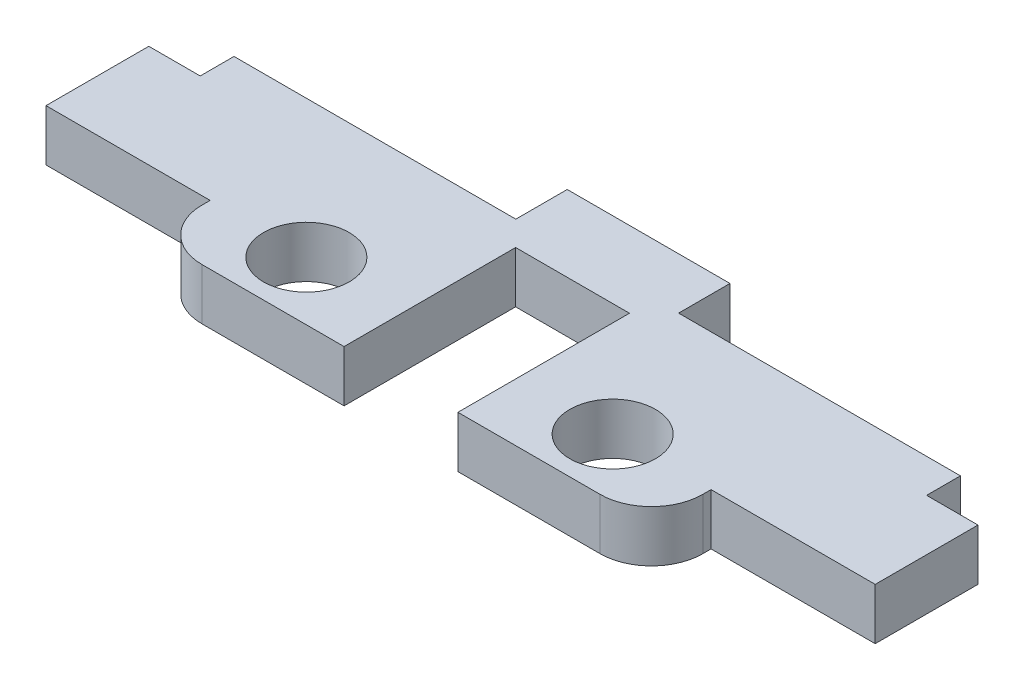
ISO-10303-21;
HEADER;
FILE_DESCRIPTION(('STEP AP214'),'2;1');
FILE_NAME('part.step','',(''),(''),'','','');
FILE_SCHEMA(('AUTOMOTIVE_DESIGN { 1 0 10303 214 1 1 1 1 }'));
ENDSEC;
DATA;
#1=APPLICATION_CONTEXT('core data for automotive mechanical design processes');
#2=APPLICATION_PROTOCOL_DEFINITION('international standard','automotive_design',2000,#1);
#3=PRODUCT_CONTEXT('',#1,'mechanical');
#4=PRODUCT('Part','Part','',(#3));
#5=PRODUCT_RELATED_PRODUCT_CATEGORY('part','',(#4));
#6=PRODUCT_DEFINITION_FORMATION('','',#4);
#7=PRODUCT_DEFINITION_CONTEXT('part definition',#1,'design');
#8=PRODUCT_DEFINITION('design','',#6,#7);
#9=PRODUCT_DEFINITION_SHAPE('','',#8);
#10=(LENGTH_UNIT() NAMED_UNIT(*) SI_UNIT(.MILLI.,.METRE.));
#11=(NAMED_UNIT(*) PLANE_ANGLE_UNIT() SI_UNIT($,.RADIAN.));
#12=(NAMED_UNIT(*) SI_UNIT($,.STERADIAN.) SOLID_ANGLE_UNIT());
#13=UNCERTAINTY_MEASURE_WITH_UNIT(LENGTH_MEASURE(1.E-05),#10,'distance_accuracy_value','');
#14=(GEOMETRIC_REPRESENTATION_CONTEXT(3) GLOBAL_UNCERTAINTY_ASSIGNED_CONTEXT((#13)) GLOBAL_UNIT_ASSIGNED_CONTEXT((#10,
#11,#12)) REPRESENTATION_CONTEXT('',''));
#15=CARTESIAN_POINT('',(0.,0.,0.));
#16=DIRECTION('',(0.,0.,1.));
#17=DIRECTION('',(1.,0.,0.));
#18=AXIS2_PLACEMENT_3D('',#15,#16,#17);
#19=CARTESIAN_POINT('',(70.0878100238819,6.,-6.40569379770578));
#20=DIRECTION('',(0.,-1.,0.));
#21=DIRECTION('',(0.,0.,-1.));
#22=AXIS2_PLACEMENT_3D('',#19,#20,#21);
#23=PLANE('',#22);
#24=CARTESIAN_POINT('',(28.9745197224591,6.,-7.23783964696655));
#25=DIRECTION('',(0.,1.,0.));
#26=DIRECTION('',(0.,0.,1.));
#27=AXIS2_PLACEMENT_3D('',#24,#25,#26);
#28=CIRCLE('',#27,5.00000000000204);
#29=CARTESIAN_POINT('',(28.9745197224591,6.,-2.23783964696451));
#30=VERTEX_POINT('',#29);
#31=EDGE_CURVE('E219',#30,#30,#28,.T.);
#32=ORIENTED_EDGE('',*,*,#31,.F.);
#33=EDGE_LOOP('',(#32));
#34=FACE_BOUND('',#33,.T.);
#35=CARTESIAN_POINT('',(70.0878100238819,6.,-6.40569379770578));
#36=DIRECTION('',(0.,1.,0.));
#37=DIRECTION('',(0.,0.,-1.));
#38=AXIS2_PLACEMENT_3D('',#35,#36,#37);
#39=CIRCLE('',#38,6.);
#40=CARTESIAN_POINT('',(70.0878100238819,6.,-0.405693797705776));
#41=VERTEX_POINT('',#40);
#42=CARTESIAN_POINT('',(76.0878100238819,6.,-6.40569379770582));
#43=VERTEX_POINT('',#42);
#44=EDGE_CURVE('E258',#41,#43,#39,.T.);
#45=ORIENTED_EDGE('',*,*,#44,.T.);
#46=DIRECTION('',(0.,0.,-1.));
#47=VECTOR('',#46,1.);
#48=CARTESIAN_POINT('',(76.0878100238819,6.,-7.36445307657716));
#49=LINE('',#48,#47);
#50=CARTESIAN_POINT('',(76.0878100238819,6.,-7.36445307657716));
#51=VERTEX_POINT('',#50);
#52=EDGE_CURVE('E136',#43,#51,#49,.T.);
#53=ORIENTED_EDGE('',*,*,#52,.T.);
#54=DIRECTION('',(1.,0.,0.));
#55=VECTOR('',#54,1.);
#56=CARTESIAN_POINT('',(95.2489083524591,6.,-7.36445307657716));
#57=LINE('',#56,#55);
#58=CARTESIAN_POINT('',(95.2489083524591,6.,-7.36445307657716));
#59=VERTEX_POINT('',#58);
#60=EDGE_CURVE('E315',#51,#59,#57,.T.);
#61=ORIENTED_EDGE('',*,*,#60,.T.);
#62=DIRECTION('',(0.,0.,-1.));
#63=VECTOR('',#62,1.);
#64=CARTESIAN_POINT('',(95.2489083524591,6.,-7.36445307657716));
#65=LINE('',#64,#63);
#66=CARTESIAN_POINT('',(95.2489083524591,6.,-19.3644530765772));
#67=VERTEX_POINT('',#66);
#68=EDGE_CURVE('E334',#59,#67,#65,.T.);
#69=ORIENTED_EDGE('',*,*,#68,.T.);
#70=DIRECTION('',(-1.,0.,0.));
#71=VECTOR('',#70,1.);
#72=CARTESIAN_POINT('',(95.2489083524591,6.,-19.3644530765772));
#73=LINE('',#72,#71);
#74=CARTESIAN_POINT('',(89.2489083524591,6.,-19.3644530765772));
#75=VERTEX_POINT('',#74);
#76=EDGE_CURVE('E331',#67,#75,#73,.T.);
#77=ORIENTED_EDGE('',*,*,#76,.T.);
#78=DIRECTION('',(0.,0.,-1.));
#79=VECTOR('',#78,1.);
#80=CARTESIAN_POINT('',(89.2489083524591,6.,-19.3644530765772));
#81=LINE('',#80,#79);
#82=CARTESIAN_POINT('',(89.2489083524591,6.,-23.3111134765772));
#83=VERTEX_POINT('',#82);
#84=EDGE_CURVE('E333',#75,#83,#81,.T.);
#85=ORIENTED_EDGE('',*,*,#84,.T.);
#86=DIRECTION('',(-1.,0.,0.));
#87=VECTOR('',#86,1.);
#88=CARTESIAN_POINT('',(56.3518187574591,6.,-23.3111134765772));
#89=LINE('',#88,#87);
#90=CARTESIAN_POINT('',(56.3518187574591,6.,-23.3111134765772));
#91=VERTEX_POINT('',#90);
#92=EDGE_CURVE('E336',#83,#91,#89,.T.);
#93=ORIENTED_EDGE('',*,*,#92,.T.);
#94=DIRECTION('',(0.,0.,-1.));
#95=VECTOR('',#94,1.);
#96=CARTESIAN_POINT('',(56.3518187574591,6.,-29.3111134765772));
#97=LINE('',#96,#95);
#98=CARTESIAN_POINT('',(56.3518187574591,6.,-29.3111134765772));
#99=VERTEX_POINT('',#98);
#100=EDGE_CURVE('E342',#91,#99,#97,.T.);
#101=ORIENTED_EDGE('',*,*,#100,.T.);
#102=DIRECTION('',(-1.,0.,0.));
#103=VECTOR('',#102,1.);
#104=CARTESIAN_POINT('',(37.3518187574591,6.,-29.3111134765772));
#105=LINE('',#104,#103);
#106=CARTESIAN_POINT('',(37.3518187574591,6.,-29.3111134765772));
#107=VERTEX_POINT('',#106);
#108=EDGE_CURVE('E344',#99,#107,#105,.T.);
#109=ORIENTED_EDGE('',*,*,#108,.T.);
#110=DIRECTION('',(0.,0.,1.));
#111=VECTOR('',#110,1.);
#112=CARTESIAN_POINT('',(37.3518187574591,6.,-29.3111134765772));
#113=LINE('',#112,#111);
#114=CARTESIAN_POINT('',(37.3518187574591,6.,-23.3111134765772));
#115=VERTEX_POINT('',#114);
#116=EDGE_CURVE('E346',#107,#115,#113,.T.);
#117=ORIENTED_EDGE('',*,*,#116,.T.);
#118=DIRECTION('',(-1.,0.,0.));
#119=VECTOR('',#118,1.);
#120=CARTESIAN_POINT('',(37.3518187574591,6.,-23.3111134765772));
#121=LINE('',#120,#119);
#122=CARTESIAN_POINT('',(4.45472916245909,6.,-23.3111134765772));
#123=VERTEX_POINT('',#122);
#124=EDGE_CURVE('E348',#115,#123,#121,.T.);
#125=ORIENTED_EDGE('',*,*,#124,.T.);
#126=DIRECTION('',(0.,0.,1.));
#127=VECTOR('',#126,1.);
#128=CARTESIAN_POINT('',(4.45472916245909,6.,-19.3644530765772));
#129=LINE('',#128,#127);
#130=CARTESIAN_POINT('',(4.45472916245909,6.,-19.3644530765772));
#131=VERTEX_POINT('',#130);
#132=EDGE_CURVE('E350',#123,#131,#129,.T.);
#133=ORIENTED_EDGE('',*,*,#132,.T.);
#134=DIRECTION('',(-1.,0.,0.));
#135=VECTOR('',#134,1.);
#136=CARTESIAN_POINT('',(-1.54527083754091,6.,-19.3644530765771));
#137=LINE('',#136,#135);
#138=CARTESIAN_POINT('',(-1.54527083754091,6.,-19.3644530765771));
#139=VERTEX_POINT('',#138);
#140=EDGE_CURVE('E352',#131,#139,#137,.T.);
#141=ORIENTED_EDGE('',*,*,#140,.T.);
#142=DIRECTION('',(0.,0.,1.));
#143=VECTOR('',#142,1.);
#144=CARTESIAN_POINT('',(-1.54527083754091,6.,-7.36445307657715));
#145=LINE('',#144,#143);
#146=CARTESIAN_POINT('',(-1.54527083754091,6.,-7.36445307657715));
#147=VERTEX_POINT('',#146);
#148=EDGE_CURVE('E354',#139,#147,#145,.T.);
#149=ORIENTED_EDGE('',*,*,#148,.T.);
#150=DIRECTION('',(1.,0.,0.));
#151=VECTOR('',#150,1.);
#152=CARTESIAN_POINT('',(17.6158274910363,6.,-7.36445307657715));
#153=LINE('',#152,#151);
#154=CARTESIAN_POINT('',(17.6158274910363,6.,-7.36445307657715));
#155=VERTEX_POINT('',#154);
#156=EDGE_CURVE('E356',#147,#155,#153,.T.);
#157=ORIENTED_EDGE('',*,*,#156,.T.);
#158=DIRECTION('',(0.,0.,1.));
#159=VECTOR('',#158,1.);
#160=CARTESIAN_POINT('',(17.6158274910363,6.,-6.40569379770582));
#161=LINE('',#160,#159);
#162=CARTESIAN_POINT('',(17.6158274910363,6.,-6.40569379770582));
#163=VERTEX_POINT('',#162);
#164=EDGE_CURVE('E358',#155,#163,#161,.T.);
#165=ORIENTED_EDGE('',*,*,#164,.T.);
#166=CARTESIAN_POINT('',(23.6158274910363,6.,-6.40569379770578));
#167=DIRECTION('',(0.,1.,0.));
#168=DIRECTION('',(0.,0.,1.));
#169=AXIS2_PLACEMENT_3D('',#166,#167,#168);
#170=CIRCLE('',#169,6.);
#171=CARTESIAN_POINT('',(23.6158274910363,6.,-0.405693797705777));
#172=VERTEX_POINT('',#171);
#173=EDGE_CURVE('E360',#163,#172,#170,.T.);
#174=ORIENTED_EDGE('',*,*,#173,.T.);
#175=DIRECTION('',(1.,0.,0.));
#176=VECTOR('',#175,1.);
#177=CARTESIAN_POINT('',(40.2068590818868,6.,-0.405693797705778));
#178=LINE('',#177,#176);
#179=CARTESIAN_POINT('',(40.2068590818868,6.,-0.405693797705778));
#180=VERTEX_POINT('',#179);
#181=EDGE_CURVE('E362',#172,#180,#178,.T.);
#182=ORIENTED_EDGE('',*,*,#181,.T.);
#183=DIRECTION('',(0.,0.,-1.));
#184=VECTOR('',#183,1.);
#185=CARTESIAN_POINT('',(40.2068590818868,6.,-0.405693797705778));
#186=LINE('',#185,#184);
#187=CARTESIAN_POINT('',(40.2068590818868,6.,-20.432362651178));
#188=VERTEX_POINT('',#187);
#189=EDGE_CURVE('E197',#180,#188,#186,.T.);
#190=ORIENTED_EDGE('',*,*,#189,.T.);
#191=DIRECTION('',(1.,0.,0.));
#192=VECTOR('',#191,1.);
#193=CARTESIAN_POINT('',(40.2068590818868,6.,-20.432362651178));
#194=LINE('',#193,#192);
#195=CARTESIAN_POINT('',(53.4967784330314,6.,-20.432362651178));
#196=VERTEX_POINT('',#195);
#197=EDGE_CURVE('E191',#188,#196,#194,.T.);
#198=ORIENTED_EDGE('',*,*,#197,.T.);
#199=DIRECTION('',(0.,0.,1.));
#200=VECTOR('',#199,1.);
#201=CARTESIAN_POINT('',(53.4967784330314,6.,-0.405693797705778));
#202=LINE('',#201,#200);
#203=CARTESIAN_POINT('',(53.4967784330314,6.,-0.405693797705778));
#204=VERTEX_POINT('',#203);
#205=EDGE_CURVE('E195',#196,#204,#202,.T.);
#206=ORIENTED_EDGE('',*,*,#205,.T.);
#207=DIRECTION('',(1.,0.,0.));
#208=VECTOR('',#207,1.);
#209=CARTESIAN_POINT('',(70.0878100238819,6.,-0.405693797705776));
#210=LINE('',#209,#208);
#211=EDGE_CURVE('E51',#204,#41,#210,.T.);
#212=ORIENTED_EDGE('',*,*,#211,.T.);
#213=EDGE_LOOP('',(#45,#53,#61,#69,#77,#85,#93,#101,#109,#117,#125,#133,#141,#149,#157,#165,
#174,#182,#190,#198,#206,#212));
#214=FACE_BOUND('',#213,.T.);
#215=CARTESIAN_POINT('',(64.7291177924591,6.,-7.23783964696655));
#216=DIRECTION('',(0.,1.,0.));
#217=DIRECTION('',(0.,0.,1.));
#218=AXIS2_PLACEMENT_3D('',#215,#216,#217);
#219=CIRCLE('',#218,5.00000000000205);
#220=CARTESIAN_POINT('',(64.7291177924591,6.,-2.2378396469645));
#221=VERTEX_POINT('',#220);
#222=EDGE_CURVE('E405',#221,#221,#219,.T.);
#223=ORIENTED_EDGE('',*,*,#222,.F.);
#224=EDGE_LOOP('',(#223));
#225=FACE_BOUND('',#224,.T.);
#226=ADVANCED_FACE('F34',(#34,#214,#225),#23,.F.);
#227=CARTESIAN_POINT('',(70.0878100238819,0.,-6.40569379770578));
#228=DIRECTION('',(0.,-1.,0.));
#229=DIRECTION('',(0.,0.,-1.));
#230=AXIS2_PLACEMENT_3D('',#227,#228,#229);
#231=PLANE('',#230);
#232=CARTESIAN_POINT('',(28.9745197224591,0.,-7.23783964696655));
#233=DIRECTION('',(0.,1.,0.));
#234=DIRECTION('',(0.,0.,1.));
#235=AXIS2_PLACEMENT_3D('',#232,#233,#234);
#236=CIRCLE('',#235,5.00000000000204);
#237=CARTESIAN_POINT('',(28.9745197224591,0.,-2.23783964696451));
#238=VERTEX_POINT('',#237);
#239=EDGE_CURVE('E410',#238,#238,#236,.T.);
#240=ORIENTED_EDGE('',*,*,#239,.T.);
#241=EDGE_LOOP('',(#240));
#242=FACE_BOUND('',#241,.T.);
#243=CARTESIAN_POINT('',(70.0878100238819,0.,-6.40569379770578));
#244=DIRECTION('',(0.,1.,0.));
#245=DIRECTION('',(0.,0.,-1.));
#246=AXIS2_PLACEMENT_3D('',#243,#244,#245);
#247=CIRCLE('',#246,6.);
#248=CARTESIAN_POINT('',(70.0878100238819,0.,-0.405693797705776));
#249=VERTEX_POINT('',#248);
#250=CARTESIAN_POINT('',(76.0878100238819,0.,-6.40569379770582));
#251=VERTEX_POINT('',#250);
#252=EDGE_CURVE('E215',#249,#251,#247,.T.);
#253=ORIENTED_EDGE('',*,*,#252,.F.);
#254=DIRECTION('',(1.,0.,0.));
#255=VECTOR('',#254,1.);
#256=CARTESIAN_POINT('',(70.0878100238819,0.,-0.405693797705776));
#257=LINE('',#256,#255);
#258=CARTESIAN_POINT('',(53.4967784330314,0.,-0.405693797705778));
#259=VERTEX_POINT('',#258);
#260=EDGE_CURVE('E128',#259,#249,#257,.T.);
#261=ORIENTED_EDGE('',*,*,#260,.F.);
#262=DIRECTION('',(0.,0.,1.));
#263=VECTOR('',#262,1.);
#264=CARTESIAN_POINT('',(53.4967784330314,0.,-0.405693797705778));
#265=LINE('',#264,#263);
#266=CARTESIAN_POINT('',(53.4967784330314,0.,-20.432362651178));
#267=VERTEX_POINT('',#266);
#268=EDGE_CURVE('E122',#267,#259,#265,.T.);
#269=ORIENTED_EDGE('',*,*,#268,.F.);
#270=DIRECTION('',(1.,0.,0.));
#271=VECTOR('',#270,1.);
#272=CARTESIAN_POINT('',(40.2068590818868,0.,-20.432362651178));
#273=LINE('',#272,#271);
#274=CARTESIAN_POINT('',(40.2068590818868,0.,-20.432362651178));
#275=VERTEX_POINT('',#274);
#276=EDGE_CURVE('E205',#275,#267,#273,.T.);
#277=ORIENTED_EDGE('',*,*,#276,.F.);
#278=DIRECTION('',(0.,0.,-1.));
#279=VECTOR('',#278,1.);
#280=CARTESIAN_POINT('',(40.2068590818868,0.,-0.405693797705778));
#281=LINE('',#280,#279);
#282=CARTESIAN_POINT('',(40.2068590818868,0.,-0.405693797705778));
#283=VERTEX_POINT('',#282);
#284=EDGE_CURVE('E253',#283,#275,#281,.T.);
#285=ORIENTED_EDGE('',*,*,#284,.F.);
#286=DIRECTION('',(1.,0.,0.));
#287=VECTOR('',#286,1.);
#288=CARTESIAN_POINT('',(40.2068590818868,0.,-0.405693797705778));
#289=LINE('',#288,#287);
#290=CARTESIAN_POINT('',(23.6158274910363,0.,-0.405693797705777));
#291=VERTEX_POINT('',#290);
#292=EDGE_CURVE('E251',#291,#283,#289,.T.);
#293=ORIENTED_EDGE('',*,*,#292,.F.);
#294=CARTESIAN_POINT('',(23.6158274910363,0.,-6.40569379770578));
#295=DIRECTION('',(0.,1.,0.));
#296=DIRECTION('',(0.,0.,1.));
#297=AXIS2_PLACEMENT_3D('',#294,#295,#296);
#298=CIRCLE('',#297,6.);
#299=CARTESIAN_POINT('',(17.6158274910363,0.,-6.40569379770582));
#300=VERTEX_POINT('',#299);
#301=EDGE_CURVE('E249',#300,#291,#298,.T.);
#302=ORIENTED_EDGE('',*,*,#301,.F.);
#303=DIRECTION('',(0.,0.,1.));
#304=VECTOR('',#303,1.);
#305=CARTESIAN_POINT('',(17.6158274910363,0.,-6.40569379770582));
#306=LINE('',#305,#304);
#307=CARTESIAN_POINT('',(17.6158274910363,0.,-7.36445307657715));
#308=VERTEX_POINT('',#307);
#309=EDGE_CURVE('E247',#308,#300,#306,.T.);
#310=ORIENTED_EDGE('',*,*,#309,.F.);
#311=DIRECTION('',(1.,0.,0.));
#312=VECTOR('',#311,1.);
#313=CARTESIAN_POINT('',(17.6158274910363,0.,-7.36445307657715));
#314=LINE('',#313,#312);
#315=CARTESIAN_POINT('',(-1.54527083754091,0.,-7.36445307657715));
#316=VERTEX_POINT('',#315);
#317=EDGE_CURVE('E245',#316,#308,#314,.T.);
#318=ORIENTED_EDGE('',*,*,#317,.F.);
#319=DIRECTION('',(0.,0.,1.));
#320=VECTOR('',#319,1.);
#321=CARTESIAN_POINT('',(-1.54527083754091,0.,-7.36445307657715));
#322=LINE('',#321,#320);
#323=CARTESIAN_POINT('',(-1.54527083754091,0.,-19.3644530765771));
#324=VERTEX_POINT('',#323);
#325=EDGE_CURVE('E243',#324,#316,#322,.T.);
#326=ORIENTED_EDGE('',*,*,#325,.F.);
#327=DIRECTION('',(-1.,0.,0.));
#328=VECTOR('',#327,1.);
#329=CARTESIAN_POINT('',(-1.54527083754091,0.,-19.3644530765771));
#330=LINE('',#329,#328);
#331=CARTESIAN_POINT('',(4.45472916245909,0.,-19.3644530765772));
#332=VERTEX_POINT('',#331);
#333=EDGE_CURVE('E241',#332,#324,#330,.T.);
#334=ORIENTED_EDGE('',*,*,#333,.F.);
#335=DIRECTION('',(0.,0.,1.));
#336=VECTOR('',#335,1.);
#337=CARTESIAN_POINT('',(4.45472916245909,0.,-19.3644530765772));
#338=LINE('',#337,#336);
#339=CARTESIAN_POINT('',(4.45472916245909,0.,-23.3111134765772));
#340=VERTEX_POINT('',#339);
#341=EDGE_CURVE('E239',#340,#332,#338,.T.);
#342=ORIENTED_EDGE('',*,*,#341,.F.);
#343=DIRECTION('',(-1.,0.,0.));
#344=VECTOR('',#343,1.);
#345=CARTESIAN_POINT('',(37.3518187574591,0.,-23.3111134765772));
#346=LINE('',#345,#344);
#347=CARTESIAN_POINT('',(37.3518187574591,0.,-23.3111134765772));
#348=VERTEX_POINT('',#347);
#349=EDGE_CURVE('E237',#348,#340,#346,.T.);
#350=ORIENTED_EDGE('',*,*,#349,.F.);
#351=DIRECTION('',(0.,0.,1.));
#352=VECTOR('',#351,1.);
#353=CARTESIAN_POINT('',(37.3518187574591,0.,-29.3111134765772));
#354=LINE('',#353,#352);
#355=CARTESIAN_POINT('',(37.3518187574591,0.,-29.3111134765772));
#356=VERTEX_POINT('',#355);
#357=EDGE_CURVE('E235',#356,#348,#354,.T.);
#358=ORIENTED_EDGE('',*,*,#357,.F.);
#359=DIRECTION('',(-1.,0.,0.));
#360=VECTOR('',#359,1.);
#361=CARTESIAN_POINT('',(37.3518187574591,0.,-29.3111134765772));
#362=LINE('',#361,#360);
#363=CARTESIAN_POINT('',(56.3518187574591,0.,-29.3111134765772));
#364=VERTEX_POINT('',#363);
#365=EDGE_CURVE('E233',#364,#356,#362,.T.);
#366=ORIENTED_EDGE('',*,*,#365,.F.);
#367=DIRECTION('',(0.,0.,-1.));
#368=VECTOR('',#367,1.);
#369=CARTESIAN_POINT('',(56.3518187574591,0.,-29.3111134765772));
#370=LINE('',#369,#368);
#371=CARTESIAN_POINT('',(56.3518187574591,0.,-23.3111134765772));
#372=VERTEX_POINT('',#371);
#373=EDGE_CURVE('E231',#372,#364,#370,.T.);
#374=ORIENTED_EDGE('',*,*,#373,.F.);
#375=DIRECTION('',(-1.,0.,0.));
#376=VECTOR('',#375,1.);
#377=CARTESIAN_POINT('',(56.3518187574591,0.,-23.3111134765772));
#378=LINE('',#377,#376);
#379=CARTESIAN_POINT('',(89.2489083524591,0.,-23.3111134765772));
#380=VERTEX_POINT('',#379);
#381=EDGE_CURVE('E229',#380,#372,#378,.T.);
#382=ORIENTED_EDGE('',*,*,#381,.F.);
#383=DIRECTION('',(0.,0.,-1.));
#384=VECTOR('',#383,1.);
#385=CARTESIAN_POINT('',(89.2489083524591,0.,-19.3644530765772));
#386=LINE('',#385,#384);
#387=CARTESIAN_POINT('',(89.2489083524591,0.,-19.3644530765772));
#388=VERTEX_POINT('',#387);
#389=EDGE_CURVE('E227',#388,#380,#386,.T.);
#390=ORIENTED_EDGE('',*,*,#389,.F.);
#391=DIRECTION('',(-1.,0.,0.));
#392=VECTOR('',#391,1.);
#393=CARTESIAN_POINT('',(95.2489083524591,0.,-19.3644530765772));
#394=LINE('',#393,#392);
#395=CARTESIAN_POINT('',(95.2489083524591,0.,-19.3644530765772));
#396=VERTEX_POINT('',#395);
#397=EDGE_CURVE('E225',#396,#388,#394,.T.);
#398=ORIENTED_EDGE('',*,*,#397,.F.);
#399=DIRECTION('',(0.,0.,-1.));
#400=VECTOR('',#399,1.);
#401=CARTESIAN_POINT('',(95.2489083524591,0.,-7.36445307657716));
#402=LINE('',#401,#400);
#403=CARTESIAN_POINT('',(95.2489083524591,0.,-7.36445307657716));
#404=VERTEX_POINT('',#403);
#405=EDGE_CURVE('E223',#404,#396,#402,.T.);
#406=ORIENTED_EDGE('',*,*,#405,.F.);
#407=DIRECTION('',(1.,0.,0.));
#408=VECTOR('',#407,1.);
#409=CARTESIAN_POINT('',(95.2489083524591,0.,-7.36445307657716));
#410=LINE('',#409,#408);
#411=CARTESIAN_POINT('',(76.0878100238819,0.,-7.36445307657716));
#412=VERTEX_POINT('',#411);
#413=EDGE_CURVE('E221',#412,#404,#410,.T.);
#414=ORIENTED_EDGE('',*,*,#413,.F.);
#415=DIRECTION('',(0.,0.,-1.));
#416=VECTOR('',#415,1.);
#417=CARTESIAN_POINT('',(76.0878100238819,0.,-7.36445307657716));
#418=LINE('',#417,#416);
#419=EDGE_CURVE('E218',#251,#412,#418,.T.);
#420=ORIENTED_EDGE('',*,*,#419,.F.);
#421=EDGE_LOOP('',(#253,#261,#269,#277,#285,#293,#302,#310,#318,#326,#334,#342,#350,#358,#366,
#374,#382,#390,#398,#406,#414,#420));
#422=FACE_BOUND('',#421,.T.);
#423=CARTESIAN_POINT('',(64.7291177924591,0.,-7.23783964696655));
#424=DIRECTION('',(0.,1.,0.));
#425=DIRECTION('',(0.,0.,1.));
#426=AXIS2_PLACEMENT_3D('',#423,#424,#425);
#427=CIRCLE('',#426,5.00000000000205);
#428=CARTESIAN_POINT('',(64.7291177924591,0.,-2.2378396469645));
#429=VERTEX_POINT('',#428);
#430=EDGE_CURVE('E408',#429,#429,#427,.T.);
#431=ORIENTED_EDGE('',*,*,#430,.T.);
#432=EDGE_LOOP('',(#431));
#433=FACE_BOUND('',#432,.T.);
#434=ADVANCED_FACE('F319',(#242,#422,#433),#231,.T.);
#435=CARTESIAN_POINT('',(70.0878100238819,6.,-6.40569379770578));
#436=DIRECTION('',(0.,-1.,0.));
#437=DIRECTION('',(0.,0.,-1.));
#438=AXIS2_PLACEMENT_3D('',#435,#436,#437);
#439=CYLINDRICAL_SURFACE('',#438,6.);
#440=ORIENTED_EDGE('',*,*,#252,.T.);
#441=DIRECTION('',(0.,-1.,0.));
#442=VECTOR('',#441,1.);
#443=CARTESIAN_POINT('',(76.0878100238819,6.,-6.40569379770582));
#444=LINE('',#443,#442);
#445=EDGE_CURVE('E11',#43,#251,#444,.T.);
#446=ORIENTED_EDGE('',*,*,#445,.F.);
#447=ORIENTED_EDGE('',*,*,#44,.F.);
#448=DIRECTION('',(0.,-1.,0.));
#449=VECTOR('',#448,1.);
#450=CARTESIAN_POINT('',(70.0878100238819,6.,-0.405693797705776));
#451=LINE('',#450,#449);
#452=EDGE_CURVE('E211',#41,#249,#451,.T.);
#453=ORIENTED_EDGE('',*,*,#452,.T.);
#454=EDGE_LOOP('',(#440,#446,#447,#453));
#455=FACE_BOUND('',#454,.T.);
#456=ADVANCED_FACE('F36',(#455),#439,.T.);
#457=CARTESIAN_POINT('',(76.0878100238819,6.,-7.36445307657716));
#458=DIRECTION('',(-1.,0.,0.));
#459=DIRECTION('',(0.,0.,1.));
#460=AXIS2_PLACEMENT_3D('',#457,#458,#459);
#461=PLANE('',#460);
#462=ORIENTED_EDGE('',*,*,#419,.T.);
#463=DIRECTION('',(0.,-1.,0.));
#464=VECTOR('',#463,1.);
#465=CARTESIAN_POINT('',(76.0878100238819,6.,-7.36445307657716));
#466=LINE('',#465,#464);
#467=EDGE_CURVE('E43',#51,#412,#466,.T.);
#468=ORIENTED_EDGE('',*,*,#467,.F.);
#469=ORIENTED_EDGE('',*,*,#52,.F.);
#470=ORIENTED_EDGE('',*,*,#445,.T.);
#471=EDGE_LOOP('',(#462,#468,#469,#470));
#472=FACE_BOUND('',#471,.T.);
#473=ADVANCED_FACE('F603',(#472),#461,.F.);
#474=CARTESIAN_POINT('',(95.2489083524591,6.,-7.36445307657716));
#475=DIRECTION('',(0.,0.,-1.));
#476=DIRECTION('',(-1.,0.,0.));
#477=AXIS2_PLACEMENT_3D('',#474,#475,#476);
#478=PLANE('',#477);
#479=ORIENTED_EDGE('',*,*,#413,.T.);
#480=DIRECTION('',(0.,-1.,0.));
#481=VECTOR('',#480,1.);
#482=CARTESIAN_POINT('',(95.2489083524591,6.,-7.36445307657716));
#483=LINE('',#482,#481);
#484=EDGE_CURVE('E307',#59,#404,#483,.T.);
#485=ORIENTED_EDGE('',*,*,#484,.F.);
#486=ORIENTED_EDGE('',*,*,#60,.F.);
#487=ORIENTED_EDGE('',*,*,#467,.T.);
#488=EDGE_LOOP('',(#479,#485,#486,#487));
#489=FACE_BOUND('',#488,.T.);
#490=ADVANCED_FACE('F313',(#489),#478,.F.);
#491=CARTESIAN_POINT('',(95.2489083524591,6.,-7.36445307657716));
#492=DIRECTION('',(-1.,0.,0.));
#493=DIRECTION('',(0.,0.,1.));
#494=AXIS2_PLACEMENT_3D('',#491,#492,#493);
#495=PLANE('',#494);
#496=ORIENTED_EDGE('',*,*,#405,.T.);
#497=DIRECTION('',(0.,-1.,0.));
#498=VECTOR('',#497,1.);
#499=CARTESIAN_POINT('',(95.2489083524591,6.,-19.3644530765772));
#500=LINE('',#499,#498);
#501=EDGE_CURVE('E304',#67,#396,#500,.T.);
#502=ORIENTED_EDGE('',*,*,#501,.F.);
#503=ORIENTED_EDGE('',*,*,#68,.F.);
#504=ORIENTED_EDGE('',*,*,#484,.T.);
#505=EDGE_LOOP('',(#496,#502,#503,#504));
#506=FACE_BOUND('',#505,.T.);
#507=ADVANCED_FACE('F325',(#506),#495,.F.);
#508=CARTESIAN_POINT('',(95.2489083524591,6.,-19.3644530765772));
#509=DIRECTION('',(0.,0.,1.));
#510=DIRECTION('',(1.,0.,0.));
#511=AXIS2_PLACEMENT_3D('',#508,#509,#510);
#512=PLANE('',#511);
#513=ORIENTED_EDGE('',*,*,#397,.T.);
#514=DIRECTION('',(0.,-1.,0.));
#515=VECTOR('',#514,1.);
#516=CARTESIAN_POINT('',(89.2489083524591,6.,-19.3644530765772));
#517=LINE('',#516,#515);
#518=EDGE_CURVE('E301',#75,#388,#517,.T.);
#519=ORIENTED_EDGE('',*,*,#518,.F.);
#520=ORIENTED_EDGE('',*,*,#76,.F.);
#521=ORIENTED_EDGE('',*,*,#501,.T.);
#522=EDGE_LOOP('',(#513,#519,#520,#521));
#523=FACE_BOUND('',#522,.T.);
#524=ADVANCED_FACE('F329',(#523),#512,.F.);
#525=CARTESIAN_POINT('',(89.2489083524591,6.,-19.3644530765772));
#526=DIRECTION('',(-1.,0.,0.));
#527=DIRECTION('',(0.,0.,1.));
#528=AXIS2_PLACEMENT_3D('',#525,#526,#527);
#529=PLANE('',#528);
#530=ORIENTED_EDGE('',*,*,#389,.T.);
#531=DIRECTION('',(0.,-1.,0.));
#532=VECTOR('',#531,1.);
#533=CARTESIAN_POINT('',(89.2489083524591,6.,-23.3111134765772));
#534=LINE('',#533,#532);
#535=EDGE_CURVE('E298',#83,#380,#534,.T.);
#536=ORIENTED_EDGE('',*,*,#535,.F.);
#537=ORIENTED_EDGE('',*,*,#84,.F.);
#538=ORIENTED_EDGE('',*,*,#518,.T.);
#539=EDGE_LOOP('',(#530,#536,#537,#538));
#540=FACE_BOUND('',#539,.T.);
#541=ADVANCED_FACE('F568',(#540),#529,.F.);
#542=CARTESIAN_POINT('',(56.3518187574591,6.,-23.3111134765772));
#543=DIRECTION('',(0.,0.,1.));
#544=DIRECTION('',(1.,0.,0.));
#545=AXIS2_PLACEMENT_3D('',#542,#543,#544);
#546=PLANE('',#545);
#547=ORIENTED_EDGE('',*,*,#381,.T.);
#548=DIRECTION('',(0.,-1.,0.));
#549=VECTOR('',#548,1.);
#550=CARTESIAN_POINT('',(56.3518187574591,6.,-23.3111134765772));
#551=LINE('',#550,#549);
#552=EDGE_CURVE('E295',#91,#372,#551,.T.);
#553=ORIENTED_EDGE('',*,*,#552,.F.);
#554=ORIENTED_EDGE('',*,*,#92,.F.);
#555=ORIENTED_EDGE('',*,*,#535,.T.);
#556=EDGE_LOOP('',(#547,#553,#554,#555));
#557=FACE_BOUND('',#556,.T.);
#558=ADVANCED_FACE('F558',(#557),#546,.F.);
#559=CARTESIAN_POINT('',(56.3518187574591,6.,-29.3111134765772));
#560=DIRECTION('',(-1.,0.,0.));
#561=DIRECTION('',(0.,0.,1.));
#562=AXIS2_PLACEMENT_3D('',#559,#560,#561);
#563=PLANE('',#562);
#564=ORIENTED_EDGE('',*,*,#373,.T.);
#565=DIRECTION('',(0.,-1.,0.));
#566=VECTOR('',#565,1.);
#567=CARTESIAN_POINT('',(56.3518187574591,6.,-29.3111134765772));
#568=LINE('',#567,#566);
#569=EDGE_CURVE('E292',#99,#364,#568,.T.);
#570=ORIENTED_EDGE('',*,*,#569,.F.);
#571=ORIENTED_EDGE('',*,*,#100,.F.);
#572=ORIENTED_EDGE('',*,*,#552,.T.);
#573=EDGE_LOOP('',(#564,#570,#571,#572));
#574=FACE_BOUND('',#573,.T.);
#575=ADVANCED_FACE('F548',(#574),#563,.F.);
#576=CARTESIAN_POINT('',(37.3518187574591,6.,-29.3111134765772));
#577=DIRECTION('',(0.,0.,1.));
#578=DIRECTION('',(1.,0.,0.));
#579=AXIS2_PLACEMENT_3D('',#576,#577,#578);
#580=PLANE('',#579);
#581=ORIENTED_EDGE('',*,*,#365,.T.);
#582=DIRECTION('',(0.,-1.,0.));
#583=VECTOR('',#582,1.);
#584=CARTESIAN_POINT('',(37.3518187574591,6.,-29.3111134765772));
#585=LINE('',#584,#583);
#586=EDGE_CURVE('E289',#107,#356,#585,.T.);
#587=ORIENTED_EDGE('',*,*,#586,.F.);
#588=ORIENTED_EDGE('',*,*,#108,.F.);
#589=ORIENTED_EDGE('',*,*,#569,.T.);
#590=EDGE_LOOP('',(#581,#587,#588,#589));
#591=FACE_BOUND('',#590,.T.);
#592=ADVANCED_FACE('F538',(#591),#580,.F.);
#593=CARTESIAN_POINT('',(37.3518187574591,6.,-29.3111134765772));
#594=DIRECTION('',(1.,0.,0.));
#595=DIRECTION('',(0.,0.,-1.));
#596=AXIS2_PLACEMENT_3D('',#593,#594,#595);
#597=PLANE('',#596);
#598=ORIENTED_EDGE('',*,*,#357,.T.);
#599=DIRECTION('',(0.,-1.,0.));
#600=VECTOR('',#599,1.);
#601=CARTESIAN_POINT('',(37.3518187574591,6.,-23.3111134765772));
#602=LINE('',#601,#600);
#603=EDGE_CURVE('E286',#115,#348,#602,.T.);
#604=ORIENTED_EDGE('',*,*,#603,.F.);
#605=ORIENTED_EDGE('',*,*,#116,.F.);
#606=ORIENTED_EDGE('',*,*,#586,.T.);
#607=EDGE_LOOP('',(#598,#604,#605,#606));
#608=FACE_BOUND('',#607,.T.);
#609=ADVANCED_FACE('F528',(#608),#597,.F.);
#610=CARTESIAN_POINT('',(37.3518187574591,6.,-23.3111134765772));
#611=DIRECTION('',(0.,0.,1.));
#612=DIRECTION('',(1.,0.,0.));
#613=AXIS2_PLACEMENT_3D('',#610,#611,#612);
#614=PLANE('',#613);
#615=ORIENTED_EDGE('',*,*,#349,.T.);
#616=DIRECTION('',(0.,-1.,0.));
#617=VECTOR('',#616,1.);
#618=CARTESIAN_POINT('',(4.45472916245909,6.,-23.3111134765772));
#619=LINE('',#618,#617);
#620=EDGE_CURVE('E283',#123,#340,#619,.T.);
#621=ORIENTED_EDGE('',*,*,#620,.F.);
#622=ORIENTED_EDGE('',*,*,#124,.F.);
#623=ORIENTED_EDGE('',*,*,#603,.T.);
#624=EDGE_LOOP('',(#615,#621,#622,#623));
#625=FACE_BOUND('',#624,.T.);
#626=ADVANCED_FACE('F518',(#625),#614,.F.);
#627=CARTESIAN_POINT('',(4.45472916245909,6.,-19.3644530765772));
#628=DIRECTION('',(1.,0.,0.));
#629=DIRECTION('',(0.,0.,-1.));
#630=AXIS2_PLACEMENT_3D('',#627,#628,#629);
#631=PLANE('',#630);
#632=ORIENTED_EDGE('',*,*,#341,.T.);
#633=DIRECTION('',(0.,-1.,0.));
#634=VECTOR('',#633,1.);
#635=CARTESIAN_POINT('',(4.45472916245909,6.,-19.3644530765772));
#636=LINE('',#635,#634);
#637=EDGE_CURVE('E280',#131,#332,#636,.T.);
#638=ORIENTED_EDGE('',*,*,#637,.F.);
#639=ORIENTED_EDGE('',*,*,#132,.F.);
#640=ORIENTED_EDGE('',*,*,#620,.T.);
#641=EDGE_LOOP('',(#632,#638,#639,#640));
#642=FACE_BOUND('',#641,.T.);
#643=ADVANCED_FACE('F508',(#642),#631,.F.);
#644=CARTESIAN_POINT('',(-1.54527083754091,6.,-19.3644530765771));
#645=DIRECTION('',(0.,0.,1.));
#646=DIRECTION('',(1.,0.,0.));
#647=AXIS2_PLACEMENT_3D('',#644,#645,#646);
#648=PLANE('',#647);
#649=ORIENTED_EDGE('',*,*,#333,.T.);
#650=DIRECTION('',(0.,-1.,0.));
#651=VECTOR('',#650,1.);
#652=CARTESIAN_POINT('',(-1.54527083754091,6.,-19.3644530765771));
#653=LINE('',#652,#651);
#654=EDGE_CURVE('E277',#139,#324,#653,.T.);
#655=ORIENTED_EDGE('',*,*,#654,.F.);
#656=ORIENTED_EDGE('',*,*,#140,.F.);
#657=ORIENTED_EDGE('',*,*,#637,.T.);
#658=EDGE_LOOP('',(#649,#655,#656,#657));
#659=FACE_BOUND('',#658,.T.);
#660=ADVANCED_FACE('F498',(#659),#648,.F.);
#661=CARTESIAN_POINT('',(-1.54527083754091,6.,-7.36445307657715));
#662=DIRECTION('',(1.,0.,0.));
#663=DIRECTION('',(0.,0.,-1.));
#664=AXIS2_PLACEMENT_3D('',#661,#662,#663);
#665=PLANE('',#664);
#666=ORIENTED_EDGE('',*,*,#325,.T.);
#667=DIRECTION('',(0.,-1.,0.));
#668=VECTOR('',#667,1.);
#669=CARTESIAN_POINT('',(-1.54527083754091,6.,-7.36445307657715));
#670=LINE('',#669,#668);
#671=EDGE_CURVE('E274',#147,#316,#670,.T.);
#672=ORIENTED_EDGE('',*,*,#671,.F.);
#673=ORIENTED_EDGE('',*,*,#148,.F.);
#674=ORIENTED_EDGE('',*,*,#654,.T.);
#675=EDGE_LOOP('',(#666,#672,#673,#674));
#676=FACE_BOUND('',#675,.T.);
#677=ADVANCED_FACE('F488',(#676),#665,.F.);
#678=CARTESIAN_POINT('',(17.6158274910363,6.,-7.36445307657715));
#679=DIRECTION('',(0.,0.,-1.));
#680=DIRECTION('',(-1.,0.,0.));
#681=AXIS2_PLACEMENT_3D('',#678,#679,#680);
#682=PLANE('',#681);
#683=ORIENTED_EDGE('',*,*,#317,.T.);
#684=DIRECTION('',(0.,-1.,0.));
#685=VECTOR('',#684,1.);
#686=CARTESIAN_POINT('',(17.6158274910363,6.,-7.36445307657715));
#687=LINE('',#686,#685);
#688=EDGE_CURVE('E271',#155,#308,#687,.T.);
#689=ORIENTED_EDGE('',*,*,#688,.F.);
#690=ORIENTED_EDGE('',*,*,#156,.F.);
#691=ORIENTED_EDGE('',*,*,#671,.T.);
#692=EDGE_LOOP('',(#683,#689,#690,#691));
#693=FACE_BOUND('',#692,.T.);
#694=ADVANCED_FACE('F478',(#693),#682,.F.);
#695=CARTESIAN_POINT('',(17.6158274910363,6.,-6.40569379770582));
#696=DIRECTION('',(1.,0.,0.));
#697=DIRECTION('',(0.,0.,-1.));
#698=AXIS2_PLACEMENT_3D('',#695,#696,#697);
#699=PLANE('',#698);
#700=ORIENTED_EDGE('',*,*,#309,.T.);
#701=DIRECTION('',(0.,-1.,0.));
#702=VECTOR('',#701,1.);
#703=CARTESIAN_POINT('',(17.6158274910363,6.,-6.40569379770582));
#704=LINE('',#703,#702);
#705=EDGE_CURVE('E268',#163,#300,#704,.T.);
#706=ORIENTED_EDGE('',*,*,#705,.F.);
#707=ORIENTED_EDGE('',*,*,#164,.F.);
#708=ORIENTED_EDGE('',*,*,#688,.T.);
#709=EDGE_LOOP('',(#700,#706,#707,#708));
#710=FACE_BOUND('',#709,.T.);
#711=ADVANCED_FACE('F468',(#710),#699,.F.);
#712=CARTESIAN_POINT('',(23.6158274910363,6.,-6.40569379770578));
#713=DIRECTION('',(0.,-1.,0.));
#714=DIRECTION('',(0.,0.,-1.));
#715=AXIS2_PLACEMENT_3D('',#712,#713,#714);
#716=CYLINDRICAL_SURFACE('',#715,6.);
#717=ORIENTED_EDGE('',*,*,#301,.T.);
#718=DIRECTION('',(0.,-1.,0.));
#719=VECTOR('',#718,1.);
#720=CARTESIAN_POINT('',(23.6158274910363,6.,-0.405693797705777));
#721=LINE('',#720,#719);
#722=EDGE_CURVE('E265',#172,#291,#721,.T.);
#723=ORIENTED_EDGE('',*,*,#722,.F.);
#724=ORIENTED_EDGE('',*,*,#173,.F.);
#725=ORIENTED_EDGE('',*,*,#705,.T.);
#726=EDGE_LOOP('',(#717,#723,#724,#725));
#727=FACE_BOUND('',#726,.T.);
#728=ADVANCED_FACE('F459',(#727),#716,.T.);
#729=CARTESIAN_POINT('',(40.2068590818868,6.,-0.405693797705778));
#730=DIRECTION('',(0.,0.,-1.));
#731=DIRECTION('',(-1.,0.,0.));
#732=AXIS2_PLACEMENT_3D('',#729,#730,#731);
#733=PLANE('',#732);
#734=ORIENTED_EDGE('',*,*,#292,.T.);
#735=DIRECTION('',(0.,-1.,0.));
#736=VECTOR('',#735,1.);
#737=CARTESIAN_POINT('',(40.2068590818868,6.,-0.405693797705778));
#738=LINE('',#737,#736);
#739=EDGE_CURVE('E262',#180,#283,#738,.T.);
#740=ORIENTED_EDGE('',*,*,#739,.F.);
#741=ORIENTED_EDGE('',*,*,#181,.F.);
#742=ORIENTED_EDGE('',*,*,#722,.T.);
#743=EDGE_LOOP('',(#734,#740,#741,#742));
#744=FACE_BOUND('',#743,.T.);
#745=ADVANCED_FACE('F368',(#744),#733,.F.);
#746=CARTESIAN_POINT('',(40.2068590818868,6.,-0.405693797705778));
#747=DIRECTION('',(-1.,0.,0.));
#748=DIRECTION('',(0.,0.,1.));
#749=AXIS2_PLACEMENT_3D('',#746,#747,#748);
#750=PLANE('',#749);
#751=ORIENTED_EDGE('',*,*,#284,.T.);
#752=DIRECTION('',(0.,-1.,0.));
#753=VECTOR('',#752,1.);
#754=CARTESIAN_POINT('',(40.2068590818868,6.,-20.432362651178));
#755=LINE('',#754,#753);
#756=EDGE_CURVE('E206',#188,#275,#755,.T.);
#757=ORIENTED_EDGE('',*,*,#756,.F.);
#758=ORIENTED_EDGE('',*,*,#189,.F.);
#759=ORIENTED_EDGE('',*,*,#739,.T.);
#760=EDGE_LOOP('',(#751,#757,#758,#759));
#761=FACE_BOUND('',#760,.T.);
#762=ADVANCED_FACE('F372',(#761),#750,.F.);
#763=CARTESIAN_POINT('',(40.2068590818868,6.,-20.432362651178));
#764=DIRECTION('',(0.,0.,-1.));
#765=DIRECTION('',(-1.,0.,0.));
#766=AXIS2_PLACEMENT_3D('',#763,#764,#765);
#767=PLANE('',#766);
#768=ORIENTED_EDGE('',*,*,#276,.T.);
#769=DIRECTION('',(0.,-1.,0.));
#770=VECTOR('',#769,1.);
#771=CARTESIAN_POINT('',(53.4967784330314,6.,-20.432362651178));
#772=LINE('',#771,#770);
#773=EDGE_CURVE('E202',#196,#267,#772,.T.);
#774=ORIENTED_EDGE('',*,*,#773,.F.);
#775=ORIENTED_EDGE('',*,*,#197,.F.);
#776=ORIENTED_EDGE('',*,*,#756,.T.);
#777=EDGE_LOOP('',(#768,#774,#775,#776));
#778=FACE_BOUND('',#777,.T.);
#779=ADVANCED_FACE('F203',(#778),#767,.F.);
#780=CARTESIAN_POINT('',(53.4967784330314,6.,-0.405693797705778));
#781=DIRECTION('',(1.,0.,0.));
#782=DIRECTION('',(0.,0.,-1.));
#783=AXIS2_PLACEMENT_3D('',#780,#781,#782);
#784=PLANE('',#783);
#785=ORIENTED_EDGE('',*,*,#268,.T.);
#786=DIRECTION('',(0.,-1.,0.));
#787=VECTOR('',#786,1.);
#788=CARTESIAN_POINT('',(53.4967784330314,6.,-0.405693797705778));
#789=LINE('',#788,#787);
#790=EDGE_CURVE('E207',#204,#259,#789,.T.);
#791=ORIENTED_EDGE('',*,*,#790,.F.);
#792=ORIENTED_EDGE('',*,*,#205,.F.);
#793=ORIENTED_EDGE('',*,*,#773,.T.);
#794=EDGE_LOOP('',(#785,#791,#792,#793));
#795=FACE_BOUND('',#794,.T.);
#796=ADVANCED_FACE('F209',(#795),#784,.F.);
#797=CARTESIAN_POINT('',(70.0878100238819,6.,-0.405693797705776));
#798=DIRECTION('',(0.,0.,-1.));
#799=DIRECTION('',(-1.,0.,0.));
#800=AXIS2_PLACEMENT_3D('',#797,#798,#799);
#801=PLANE('',#800);
#802=ORIENTED_EDGE('',*,*,#260,.T.);
#803=ORIENTED_EDGE('',*,*,#452,.F.);
#804=ORIENTED_EDGE('',*,*,#211,.F.);
#805=ORIENTED_EDGE('',*,*,#790,.T.);
#806=EDGE_LOOP('',(#802,#803,#804,#805));
#807=FACE_BOUND('',#806,.T.);
#808=ADVANCED_FACE('F376',(#807),#801,.F.);
#809=CARTESIAN_POINT('',(28.9745197224591,6.,-7.23783964696655));
#810=DIRECTION('',(0.,-1.,0.));
#811=DIRECTION('',(0.,0.,-1.));
#812=AXIS2_PLACEMENT_3D('',#809,#810,#811);
#813=CYLINDRICAL_SURFACE('',#812,5.00000000000204);
#814=ORIENTED_EDGE('',*,*,#31,.T.);
#815=EDGE_LOOP('',(#814));
#816=FACE_BOUND('',#815,.T.);
#817=ORIENTED_EDGE('',*,*,#239,.F.);
#818=EDGE_LOOP('',(#817));
#819=FACE_BOUND('',#818,.T.);
#820=ADVANCED_FACE('F378',(#816,#819),#813,.F.);
#821=CARTESIAN_POINT('',(64.7291177924591,6.,-7.23783964696655));
#822=DIRECTION('',(0.,-1.,0.));
#823=DIRECTION('',(0.,0.,-1.));
#824=AXIS2_PLACEMENT_3D('',#821,#822,#823);
#825=CYLINDRICAL_SURFACE('',#824,5.00000000000205);
#826=ORIENTED_EDGE('',*,*,#222,.T.);
#827=EDGE_LOOP('',(#826));
#828=FACE_BOUND('',#827,.T.);
#829=ORIENTED_EDGE('',*,*,#430,.F.);
#830=EDGE_LOOP('',(#829));
#831=FACE_BOUND('',#830,.T.);
#832=ADVANCED_FACE('F384',(#828,#831),#825,.F.);
#833=CLOSED_SHELL('',(#226,#434,#456,#473,#490,#507,#524,#541,#558,#575,#592,#609,#626,#643,
#660,#677,#694,#711,#728,#745,#762,#779,#796,#808,#820,#832));
#834=MANIFOLD_SOLID_BREP('B2',#833);
#835=ADVANCED_BREP_SHAPE_REPRESENTATION('',(#18,#834),#14);
#836=SHAPE_DEFINITION_REPRESENTATION(#9,#835);
ENDSEC;
END-ISO-10303-21;
